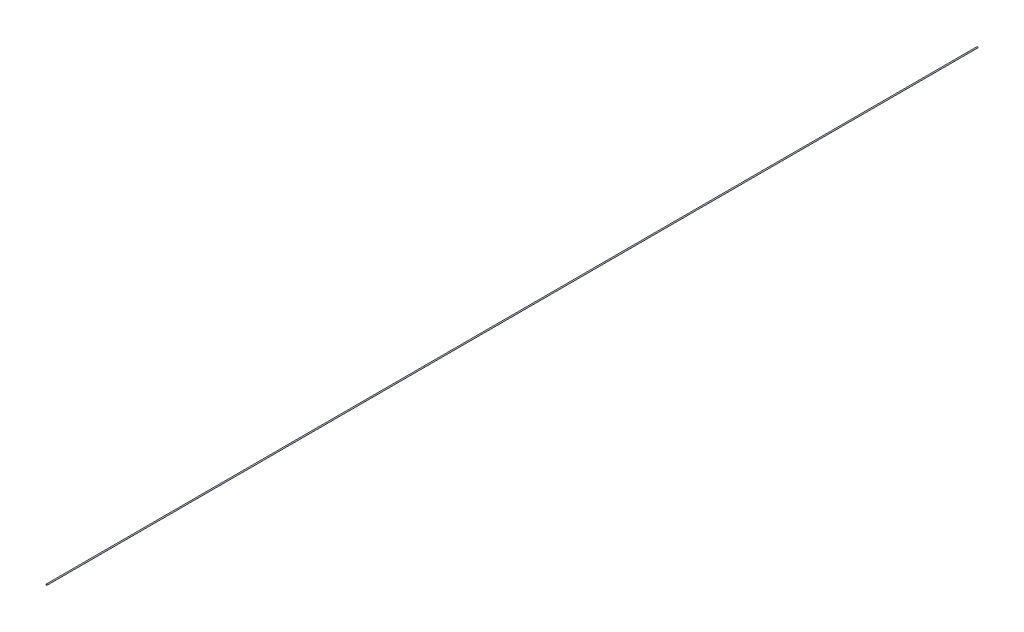
ISO-10303-21;
HEADER;
FILE_DESCRIPTION(('STEP AP214'),'2;1');
FILE_NAME('part.step','',(''),(''),'','','');
FILE_SCHEMA(('AUTOMOTIVE_DESIGN { 1 0 10303 214 1 1 1 1 }'));
ENDSEC;
DATA;
#1=APPLICATION_CONTEXT('core data for automotive mechanical design processes');
#2=APPLICATION_PROTOCOL_DEFINITION('international standard','automotive_design',2000,#1);
#3=PRODUCT_CONTEXT('',#1,'mechanical');
#4=PRODUCT('Part','Part','',(#3));
#5=PRODUCT_RELATED_PRODUCT_CATEGORY('part','',(#4));
#6=PRODUCT_DEFINITION_FORMATION('','',#4);
#7=PRODUCT_DEFINITION_CONTEXT('part definition',#1,'design');
#8=PRODUCT_DEFINITION('design','',#6,#7);
#9=PRODUCT_DEFINITION_SHAPE('','',#8);
#10=(LENGTH_UNIT() NAMED_UNIT(*) SI_UNIT(.MILLI.,.METRE.));
#11=(NAMED_UNIT(*) PLANE_ANGLE_UNIT() SI_UNIT($,.RADIAN.));
#12=(NAMED_UNIT(*) SI_UNIT($,.STERADIAN.) SOLID_ANGLE_UNIT());
#13=UNCERTAINTY_MEASURE_WITH_UNIT(LENGTH_MEASURE(1.E-05),#10,'distance_accuracy_value','');
#14=(GEOMETRIC_REPRESENTATION_CONTEXT(3) GLOBAL_UNCERTAINTY_ASSIGNED_CONTEXT((#13)) GLOBAL_UNIT_ASSIGNED_CONTEXT((#10,
#11,#12)) REPRESENTATION_CONTEXT('',''));
#15=CARTESIAN_POINT('',(0.,0.,0.));
#16=DIRECTION('',(0.,0.,1.));
#17=DIRECTION('',(1.,0.,0.));
#18=AXIS2_PLACEMENT_3D('',#15,#16,#17);
#19=CARTESIAN_POINT('',(0.,0.,5000.));
#20=DIRECTION('',(0.,0.,-1.));
#21=DIRECTION('',(-1.,0.,0.));
#22=AXIS2_PLACEMENT_3D('',#19,#20,#21);
#23=CYLINDRICAL_SURFACE('',#22,3.);
#24=CARTESIAN_POINT('',(0.,0.,5000.));
#25=DIRECTION('',(0.,0.,1.));
#26=DIRECTION('',(1.,0.,0.));
#27=AXIS2_PLACEMENT_3D('',#24,#25,#26);
#28=CIRCLE('',#27,3.);
#29=CARTESIAN_POINT('',(3.,0.,5000.));
#30=VERTEX_POINT('',#29);
#31=EDGE_CURVE('E10',#30,#30,#28,.T.);
#32=ORIENTED_EDGE('',*,*,#31,.F.);
#33=EDGE_LOOP('',(#32));
#34=FACE_BOUND('',#33,.T.);
#35=CARTESIAN_POINT('',(0.,0.,0.));
#36=DIRECTION('',(0.,0.,1.));
#37=DIRECTION('',(1.,0.,0.));
#38=AXIS2_PLACEMENT_3D('',#35,#36,#37);
#39=CIRCLE('',#38,3.);
#40=CARTESIAN_POINT('',(3.,0.,0.));
#41=VERTEX_POINT('',#40);
#42=EDGE_CURVE('E40',#41,#41,#39,.T.);
#43=ORIENTED_EDGE('',*,*,#42,.T.);
#44=EDGE_LOOP('',(#43));
#45=FACE_BOUND('',#44,.T.);
#46=ADVANCED_FACE('F37',(#34,#45),#23,.T.);
#47=CARTESIAN_POINT('',(0.,0.,5000.));
#48=DIRECTION('',(0.,0.,1.));
#49=DIRECTION('',(1.,0.,0.));
#50=AXIS2_PLACEMENT_3D('',#47,#48,#49);
#51=PLANE('',#50);
#52=ORIENTED_EDGE('',*,*,#31,.T.);
#53=EDGE_LOOP('',(#52));
#54=FACE_BOUND('',#53,.T.);
#55=ADVANCED_FACE('F52',(#54),#51,.T.);
#56=CARTESIAN_POINT('',(0.,0.,0.));
#57=DIRECTION('',(0.,0.,1.));
#58=DIRECTION('',(1.,0.,0.));
#59=AXIS2_PLACEMENT_3D('',#56,#57,#58);
#60=PLANE('',#59);
#61=ORIENTED_EDGE('',*,*,#42,.F.);
#62=EDGE_LOOP('',(#61));
#63=FACE_BOUND('',#62,.T.);
#64=ADVANCED_FACE('F50',(#63),#60,.F.);
#65=CLOSED_SHELL('',(#46,#55,#64));
#66=MANIFOLD_SOLID_BREP('B2',#65);
#67=ADVANCED_BREP_SHAPE_REPRESENTATION('',(#18,#66),#14);
#68=SHAPE_DEFINITION_REPRESENTATION(#9,#67);
ENDSEC;
END-ISO-10303-21;
